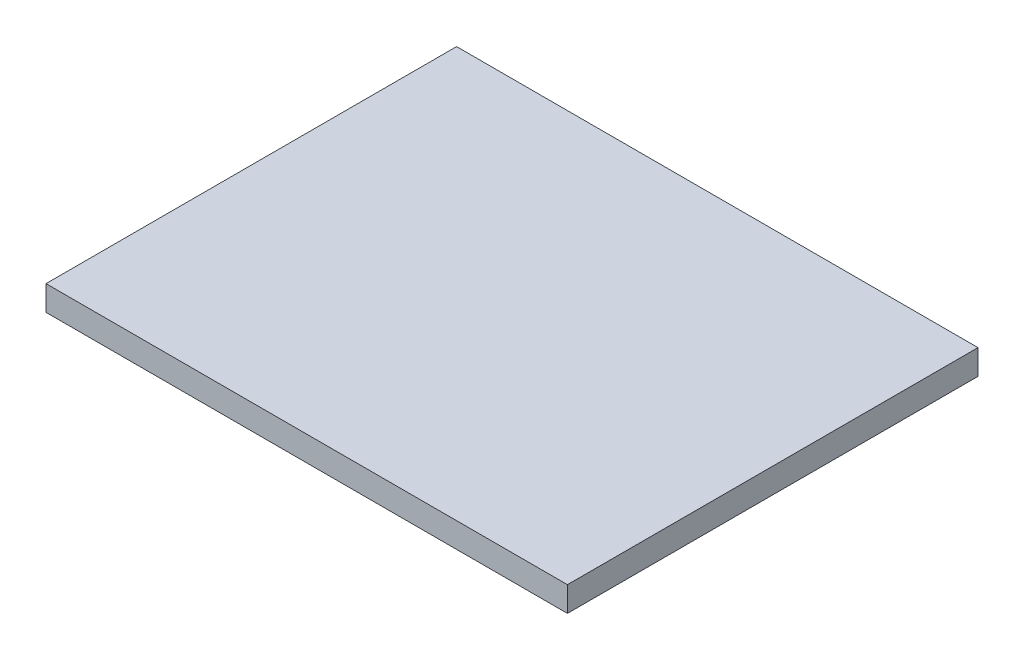
ISO-10303-21;
HEADER;
FILE_DESCRIPTION(('STEP AP214'),'2;1');
FILE_NAME('part.step','',(''),(''),'','','');
FILE_SCHEMA(('AUTOMOTIVE_DESIGN { 1 0 10303 214 1 1 1 1 }'));
ENDSEC;
DATA;
#1=APPLICATION_CONTEXT('core data for automotive mechanical design processes');
#2=APPLICATION_PROTOCOL_DEFINITION('international standard','automotive_design',2000,#1);
#3=PRODUCT_CONTEXT('',#1,'mechanical');
#4=PRODUCT('Part','Part','',(#3));
#5=PRODUCT_RELATED_PRODUCT_CATEGORY('part','',(#4));
#6=PRODUCT_DEFINITION_FORMATION('','',#4);
#7=PRODUCT_DEFINITION_CONTEXT('part definition',#1,'design');
#8=PRODUCT_DEFINITION('design','',#6,#7);
#9=PRODUCT_DEFINITION_SHAPE('','',#8);
#10=(LENGTH_UNIT() NAMED_UNIT(*) SI_UNIT(.MILLI.,.METRE.));
#11=(NAMED_UNIT(*) PLANE_ANGLE_UNIT() SI_UNIT($,.RADIAN.));
#12=(NAMED_UNIT(*) SI_UNIT($,.STERADIAN.) SOLID_ANGLE_UNIT());
#13=UNCERTAINTY_MEASURE_WITH_UNIT(LENGTH_MEASURE(1.E-05),#10,'distance_accuracy_value','');
#14=(GEOMETRIC_REPRESENTATION_CONTEXT(3) GLOBAL_UNCERTAINTY_ASSIGNED_CONTEXT((#13)) GLOBAL_UNIT_ASSIGNED_CONTEXT((#10,
#11,#12)) REPRESENTATION_CONTEXT('',''));
#15=CARTESIAN_POINT('',(0.,0.,0.));
#16=DIRECTION('',(0.,0.,1.));
#17=DIRECTION('',(1.,0.,0.));
#18=AXIS2_PLACEMENT_3D('',#15,#16,#17);
#19=CARTESIAN_POINT('',(3.81,0.18200116,6.0000007));
#20=DIRECTION('',(0.,0.,-1.));
#21=DIRECTION('',(0.,-1.,0.));
#22=AXIS2_PLACEMENT_3D('',#19,#20,#21);
#23=PLANE('',#22);
#24=DIRECTION('',(-1.,0.,0.));
#25=VECTOR('',#24,1.);
#26=CARTESIAN_POINT('',(3.81,0.18200116,6.0000007));
#27=LINE('',#26,#25);
#28=CARTESIAN_POINT('',(3.81,0.18200116,6.0000007));
#29=VERTEX_POINT('',#28);
#30=CARTESIAN_POINT('',(-3.81,0.18200116,6.0000007));
#31=VERTEX_POINT('',#30);
#32=EDGE_CURVE('E82',#29,#31,#27,.T.);
#33=ORIENTED_EDGE('',*,*,#32,.T.);
#34=DIRECTION('',(0.,-1.,0.));
#35=VECTOR('',#34,1.);
#36=CARTESIAN_POINT('',(-3.81,0.18200116,6.0000007));
#37=LINE('',#36,#35);
#38=CARTESIAN_POINT('',(-3.81,-0.18199862,6.0000007));
#39=VERTEX_POINT('',#38);
#40=EDGE_CURVE('E106',#31,#39,#37,.T.);
#41=ORIENTED_EDGE('',*,*,#40,.T.);
#42=DIRECTION('',(1.,0.,0.));
#43=VECTOR('',#42,1.);
#44=CARTESIAN_POINT('',(-3.81,-0.18199862,6.0000007));
#45=LINE('',#44,#43);
#46=CARTESIAN_POINT('',(3.81,-0.18199862,6.0000007));
#47=VERTEX_POINT('',#46);
#48=EDGE_CURVE('E74',#39,#47,#45,.T.);
#49=ORIENTED_EDGE('',*,*,#48,.T.);
#50=DIRECTION('',(0.,1.,0.));
#51=VECTOR('',#50,1.);
#52=CARTESIAN_POINT('',(3.81,-0.18199862,6.0000007));
#53=LINE('',#52,#51);
#54=EDGE_CURVE('E11',#47,#29,#53,.T.);
#55=ORIENTED_EDGE('',*,*,#54,.T.);
#56=EDGE_LOOP('',(#33,#41,#49,#55));
#57=FACE_BOUND('',#56,.T.);
#58=ADVANCED_FACE('F17',(#57),#23,.F.);
#59=CARTESIAN_POINT('',(3.81,0.18200116,0.));
#60=DIRECTION('',(0.,0.,-1.));
#61=DIRECTION('',(0.,-1.,0.));
#62=AXIS2_PLACEMENT_3D('',#59,#60,#61);
#63=PLANE('',#62);
#64=DIRECTION('',(0.,1.,0.));
#65=VECTOR('',#64,1.);
#66=CARTESIAN_POINT('',(3.81,-0.18199862,0.));
#67=LINE('',#66,#65);
#68=CARTESIAN_POINT('',(3.81,-0.18199862,0.));
#69=VERTEX_POINT('',#68);
#70=CARTESIAN_POINT('',(3.81,0.18200116,0.));
#71=VERTEX_POINT('',#70);
#72=EDGE_CURVE('E26',#69,#71,#67,.T.);
#73=ORIENTED_EDGE('',*,*,#72,.F.);
#74=DIRECTION('',(1.,0.,0.));
#75=VECTOR('',#74,1.);
#76=CARTESIAN_POINT('',(-3.81,-0.18199862,0.));
#77=LINE('',#76,#75);
#78=CARTESIAN_POINT('',(-3.81,-0.18199862,0.));
#79=VERTEX_POINT('',#78);
#80=EDGE_CURVE('E110',#79,#69,#77,.T.);
#81=ORIENTED_EDGE('',*,*,#80,.F.);
#82=DIRECTION('',(0.,-1.,0.));
#83=VECTOR('',#82,1.);
#84=CARTESIAN_POINT('',(-3.81,0.18200116,0.));
#85=LINE('',#84,#83);
#86=CARTESIAN_POINT('',(-3.81,0.18200116,0.));
#87=VERTEX_POINT('',#86);
#88=EDGE_CURVE('E84',#87,#79,#85,.T.);
#89=ORIENTED_EDGE('',*,*,#88,.F.);
#90=DIRECTION('',(-1.,0.,0.));
#91=VECTOR('',#90,1.);
#92=CARTESIAN_POINT('',(3.81,0.18200116,0.));
#93=LINE('',#92,#91);
#94=EDGE_CURVE('E80',#71,#87,#93,.T.);
#95=ORIENTED_EDGE('',*,*,#94,.F.);
#96=EDGE_LOOP('',(#73,#81,#89,#95));
#97=FACE_BOUND('',#96,.T.);
#98=ADVANCED_FACE('F86',(#97),#63,.T.);
#99=CARTESIAN_POINT('',(3.81,-0.18199862,0.));
#100=DIRECTION('',(-1.,0.,0.));
#101=DIRECTION('',(0.,0.,1.));
#102=AXIS2_PLACEMENT_3D('',#99,#100,#101);
#103=PLANE('',#102);
#104=ORIENTED_EDGE('',*,*,#72,.T.);
#105=DIRECTION('',(0.,0.,1.));
#106=VECTOR('',#105,1.);
#107=CARTESIAN_POINT('',(3.81,0.18200116,0.));
#108=LINE('',#107,#106);
#109=EDGE_CURVE('E69',#71,#29,#108,.T.);
#110=ORIENTED_EDGE('',*,*,#109,.T.);
#111=ORIENTED_EDGE('',*,*,#54,.F.);
#112=DIRECTION('',(0.,0.,1.));
#113=VECTOR('',#112,1.);
#114=CARTESIAN_POINT('',(3.81,-0.18199862,0.));
#115=LINE('',#114,#113);
#116=EDGE_CURVE('E20',#69,#47,#115,.T.);
#117=ORIENTED_EDGE('',*,*,#116,.F.);
#118=EDGE_LOOP('',(#104,#110,#111,#117));
#119=FACE_BOUND('',#118,.T.);
#120=ADVANCED_FACE('F68',(#119),#103,.F.);
#121=CARTESIAN_POINT('',(-3.81,-0.18199862,0.));
#122=DIRECTION('',(0.,1.,0.));
#123=DIRECTION('',(1.,0.,0.));
#124=AXIS2_PLACEMENT_3D('',#121,#122,#123);
#125=PLANE('',#124);
#126=ORIENTED_EDGE('',*,*,#80,.T.);
#127=ORIENTED_EDGE('',*,*,#116,.T.);
#128=ORIENTED_EDGE('',*,*,#48,.F.);
#129=DIRECTION('',(0.,0.,1.));
#130=VECTOR('',#129,1.);
#131=CARTESIAN_POINT('',(-3.81,-0.18199862,0.));
#132=LINE('',#131,#130);
#133=EDGE_CURVE('E102',#79,#39,#132,.T.);
#134=ORIENTED_EDGE('',*,*,#133,.F.);
#135=EDGE_LOOP('',(#126,#127,#128,#134));
#136=FACE_BOUND('',#135,.T.);
#137=ADVANCED_FACE('F120',(#136),#125,.F.);
#138=CARTESIAN_POINT('',(-3.81,0.18200116,0.));
#139=DIRECTION('',(1.,0.,0.));
#140=DIRECTION('',(0.,1.,0.));
#141=AXIS2_PLACEMENT_3D('',#138,#139,#140);
#142=PLANE('',#141);
#143=ORIENTED_EDGE('',*,*,#88,.T.);
#144=ORIENTED_EDGE('',*,*,#133,.T.);
#145=ORIENTED_EDGE('',*,*,#40,.F.);
#146=DIRECTION('',(0.,0.,1.));
#147=VECTOR('',#146,1.);
#148=CARTESIAN_POINT('',(-3.81,0.18200116,0.));
#149=LINE('',#148,#147);
#150=EDGE_CURVE('E90',#87,#31,#149,.T.);
#151=ORIENTED_EDGE('',*,*,#150,.F.);
#152=EDGE_LOOP('',(#143,#144,#145,#151));
#153=FACE_BOUND('',#152,.T.);
#154=ADVANCED_FACE('F123',(#153),#142,.F.);
#155=CARTESIAN_POINT('',(3.81,0.18200116,0.));
#156=DIRECTION('',(0.,-1.,0.));
#157=DIRECTION('',(0.,0.,-1.));
#158=AXIS2_PLACEMENT_3D('',#155,#156,#157);
#159=PLANE('',#158);
#160=ORIENTED_EDGE('',*,*,#94,.T.);
#161=ORIENTED_EDGE('',*,*,#150,.T.);
#162=ORIENTED_EDGE('',*,*,#32,.F.);
#163=ORIENTED_EDGE('',*,*,#109,.F.);
#164=EDGE_LOOP('',(#160,#161,#162,#163));
#165=FACE_BOUND('',#164,.T.);
#166=ADVANCED_FACE('F78',(#165),#159,.F.);
#167=CLOSED_SHELL('',(#58,#98,#120,#137,#154,#166));
#168=MANIFOLD_SOLID_BREP('B1',#167);
#169=ADVANCED_BREP_SHAPE_REPRESENTATION('',(#18,#168),#14);
#170=SHAPE_DEFINITION_REPRESENTATION(#9,#169);
ENDSEC;
END-ISO-10303-21;
